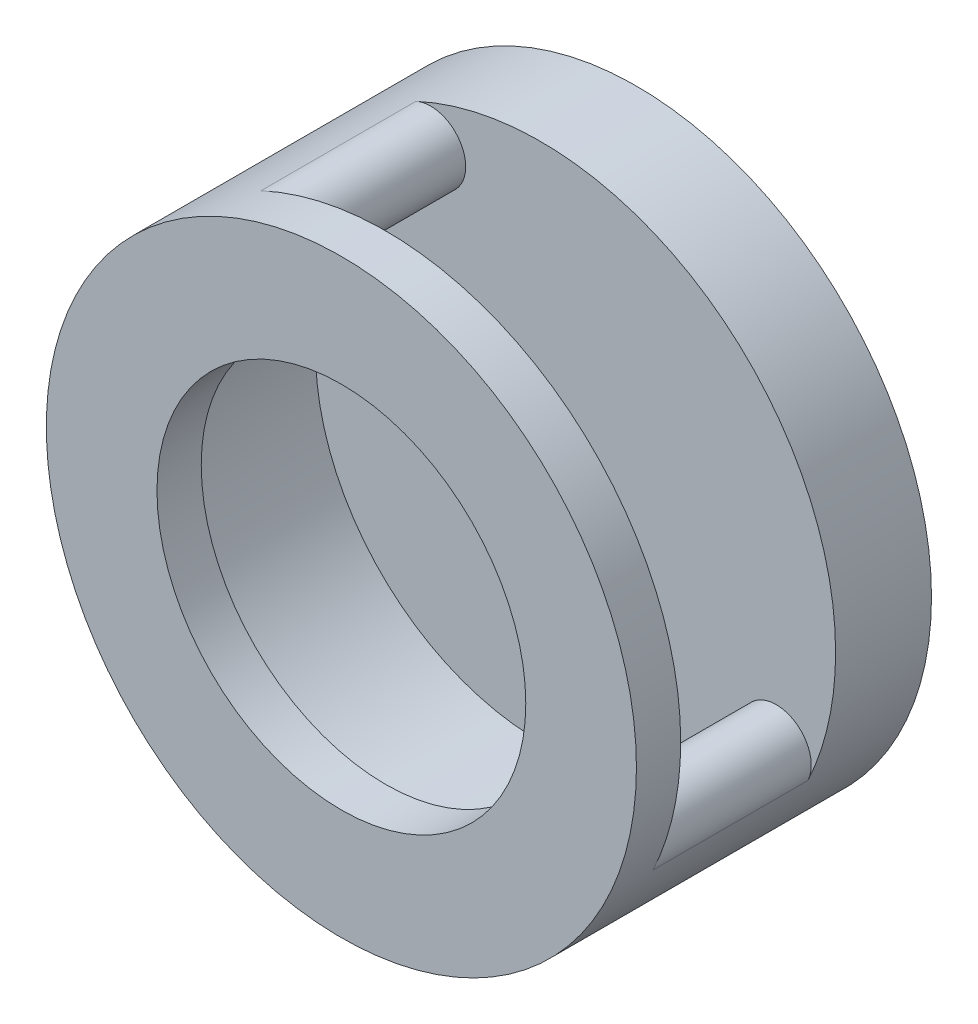
ISO-10303-21;
HEADER;
FILE_DESCRIPTION(('STEP AP214'),'2;1');
FILE_NAME('part.step','',(''),(''),'','','');
FILE_SCHEMA(('AUTOMOTIVE_DESIGN { 1 0 10303 214 1 1 1 1 }'));
ENDSEC;
DATA;
#1=APPLICATION_CONTEXT('core data for automotive mechanical design processes');
#2=APPLICATION_PROTOCOL_DEFINITION('international standard','automotive_design',2000,#1);
#3=PRODUCT_CONTEXT('',#1,'mechanical');
#4=PRODUCT('Part','Part','',(#3));
#5=PRODUCT_RELATED_PRODUCT_CATEGORY('part','',(#4));
#6=PRODUCT_DEFINITION_FORMATION('','',#4);
#7=PRODUCT_DEFINITION_CONTEXT('part definition',#1,'design');
#8=PRODUCT_DEFINITION('design','',#6,#7);
#9=PRODUCT_DEFINITION_SHAPE('','',#8);
#10=(LENGTH_UNIT() NAMED_UNIT(*) SI_UNIT(.MILLI.,.METRE.));
#11=(NAMED_UNIT(*) PLANE_ANGLE_UNIT() SI_UNIT($,.RADIAN.));
#12=(NAMED_UNIT(*) SI_UNIT($,.STERADIAN.) SOLID_ANGLE_UNIT());
#13=UNCERTAINTY_MEASURE_WITH_UNIT(LENGTH_MEASURE(1.E-05),#10,'distance_accuracy_value','');
#14=(GEOMETRIC_REPRESENTATION_CONTEXT(3) GLOBAL_UNCERTAINTY_ASSIGNED_CONTEXT((#13)) GLOBAL_UNIT_ASSIGNED_CONTEXT((#10,
#11,#12)) REPRESENTATION_CONTEXT('',''));
#15=CARTESIAN_POINT('',(0.,0.,0.));
#16=DIRECTION('',(0.,0.,1.));
#17=DIRECTION('',(1.,0.,0.));
#18=AXIS2_PLACEMENT_3D('',#15,#16,#17);
#19=CARTESIAN_POINT('',(0.,0.,4.));
#20=DIRECTION('',(0.,0.,-1.));
#21=DIRECTION('',(-1.,0.,0.));
#22=AXIS2_PLACEMENT_3D('',#19,#20,#21);
#23=CYLINDRICAL_SURFACE('',#22,4.);
#24=CARTESIAN_POINT('',(0.,0.,0.));
#25=DIRECTION('',(0.,0.,1.));
#26=DIRECTION('',(1.,0.,0.));
#27=AXIS2_PLACEMENT_3D('',#24,#25,#26);
#28=CIRCLE('',#27,4.);
#29=CARTESIAN_POINT('',(4.,0.,0.));
#30=VERTEX_POINT('',#29);
#31=EDGE_CURVE('E130',#30,#30,#28,.T.);
#32=ORIENTED_EDGE('',*,*,#31,.T.);
#33=EDGE_LOOP('',(#32));
#34=FACE_BOUND('',#33,.T.);
#35=CARTESIAN_POINT('',(0.,0.,4.));
#36=DIRECTION('',(0.,0.,1.));
#37=DIRECTION('',(1.,0.,0.));
#38=AXIS2_PLACEMENT_3D('',#35,#36,#37);
#39=CIRCLE('',#38,4.);
#40=CARTESIAN_POINT('',(4.,0.,4.));
#41=VERTEX_POINT('',#40);
#42=EDGE_CURVE('E131',#41,#41,#39,.T.);
#43=ORIENTED_EDGE('',*,*,#42,.F.);
#44=EDGE_LOOP('',(#43));
#45=FACE_BOUND('',#44,.T.);
#46=CARTESIAN_POINT('',(0.,0.,1.3));
#47=DIRECTION('',(0.,0.,1.));
#48=DIRECTION('',(1.,0.,0.));
#49=AXIS2_PLACEMENT_3D('',#46,#47,#48);
#50=CIRCLE('',#49,4.);
#51=CARTESIAN_POINT('',(3.62523114814661,-1.69047304696278,1.3));
#52=VERTEX_POINT('',#51);
#53=CARTESIAN_POINT('',(-1.69047304696278,3.62523114814661,1.3));
#54=VERTEX_POINT('',#53);
#55=EDGE_CURVE('E11',#52,#54,#50,.T.);
#56=ORIENTED_EDGE('',*,*,#55,.F.);
#57=DIRECTION('',(0.,0.,1.));
#58=VECTOR('',#57,1.);
#59=CARTESIAN_POINT('',(3.62523114814661,-1.69047304696278,1.3));
#60=LINE('',#59,#58);
#61=CARTESIAN_POINT('',(3.62523114814661,-1.69047304696278,3.4));
#62=VERTEX_POINT('',#61);
#63=EDGE_CURVE('E94',#52,#62,#60,.T.);
#64=ORIENTED_EDGE('',*,*,#63,.T.);
#65=CARTESIAN_POINT('',(0.,0.,3.4));
#66=DIRECTION('',(0.,0.,1.));
#67=DIRECTION('',(1.,0.,0.));
#68=AXIS2_PLACEMENT_3D('',#65,#66,#67);
#69=CIRCLE('',#68,4.);
#70=CARTESIAN_POINT('',(-1.69047304696278,3.62523114814661,3.4));
#71=VERTEX_POINT('',#70);
#72=EDGE_CURVE('E47',#62,#71,#69,.T.);
#73=ORIENTED_EDGE('',*,*,#72,.T.);
#74=DIRECTION('',(0.,0.,1.));
#75=VECTOR('',#74,1.);
#76=CARTESIAN_POINT('',(-1.69047304696278,3.62523114814661,1.3));
#77=LINE('',#76,#75);
#78=EDGE_CURVE('E115',#54,#71,#77,.T.);
#79=ORIENTED_EDGE('',*,*,#78,.F.);
#80=EDGE_LOOP('',(#56,#64,#73,#79));
#81=FACE_BOUND('',#80,.T.);
#82=ADVANCED_FACE('F39',(#34,#45,#81),#23,.T.);
#83=CARTESIAN_POINT('',(0.,0.,4.));
#84=DIRECTION('',(0.,0.,1.));
#85=DIRECTION('',(1.,0.,0.));
#86=AXIS2_PLACEMENT_3D('',#83,#84,#85);
#87=PLANE('',#86);
#88=CARTESIAN_POINT('',(0.,0.,4.));
#89=DIRECTION('',(0.,0.,1.));
#90=DIRECTION('',(1.,0.,0.));
#91=AXIS2_PLACEMENT_3D('',#88,#89,#90);
#92=CIRCLE('',#91,2.5);
#93=CARTESIAN_POINT('',(2.5,0.,4.));
#94=VERTEX_POINT('',#93);
#95=EDGE_CURVE('E126',#94,#94,#92,.T.);
#96=ORIENTED_EDGE('',*,*,#95,.F.);
#97=EDGE_LOOP('',(#96));
#98=FACE_BOUND('',#97,.T.);
#99=ORIENTED_EDGE('',*,*,#42,.T.);
#100=EDGE_LOOP('',(#99));
#101=FACE_BOUND('',#100,.T.);
#102=ADVANCED_FACE('F154',(#98,#101),#87,.T.);
#103=CARTESIAN_POINT('',(0.,0.,0.));
#104=DIRECTION('',(0.,0.,1.));
#105=DIRECTION('',(1.,0.,0.));
#106=AXIS2_PLACEMENT_3D('',#103,#104,#105);
#107=PLANE('',#106);
#108=ORIENTED_EDGE('',*,*,#31,.F.);
#109=EDGE_LOOP('',(#108));
#110=FACE_BOUND('',#109,.T.);
#111=ADVANCED_FACE('F159',(#110),#107,.F.);
#112=CARTESIAN_POINT('',(0.,0.,3.4));
#113=DIRECTION('',(0.,0.,1.));
#114=DIRECTION('',(1.,0.,0.));
#115=AXIS2_PLACEMENT_3D('',#112,#113,#114);
#116=CYLINDRICAL_SURFACE('',#115,2.5);
#117=CARTESIAN_POINT('',(0.,0.,3.4));
#118=DIRECTION('',(0.,0.,1.));
#119=DIRECTION('',(1.,0.,0.));
#120=AXIS2_PLACEMENT_3D('',#117,#118,#119);
#121=CIRCLE('',#120,2.5);
#122=CARTESIAN_POINT('',(2.5,0.,3.4));
#123=VERTEX_POINT('',#122);
#124=EDGE_CURVE('E118',#123,#123,#121,.T.);
#125=ORIENTED_EDGE('',*,*,#124,.F.);
#126=EDGE_LOOP('',(#125));
#127=FACE_BOUND('',#126,.T.);
#128=ORIENTED_EDGE('',*,*,#95,.T.);
#129=EDGE_LOOP('',(#128));
#130=FACE_BOUND('',#129,.T.);
#131=ADVANCED_FACE('F168',(#127,#130),#116,.F.);
#132=CARTESIAN_POINT('',(-1.48972937263595,3.1947349493042,1.3));
#133=DIRECTION('',(0.,0.,1.));
#134=DIRECTION('',(1.,0.,0.));
#135=AXIS2_PLACEMENT_3D('',#132,#133,#134);
#136=PLANE('',#135);
#137=ORIENTED_EDGE('',*,*,#55,.T.);
#138=CARTESIAN_POINT('',(-1.48972937263595,3.1947349493042,1.3));
#139=DIRECTION('',(0.,0.,-1.));
#140=DIRECTION('',(1.,0.,0.));
#141=AXIS2_PLACEMENT_3D('',#138,#139,#140);
#142=CIRCLE('',#141,0.475);
#143=CARTESIAN_POINT('',(-1.28898569830912,2.76423875046179,1.3));
#144=VERTEX_POINT('',#143);
#145=EDGE_CURVE('E102',#54,#144,#142,.T.);
#146=ORIENTED_EDGE('',*,*,#145,.T.);
#147=CARTESIAN_POINT('',(0.,0.,1.3));
#148=DIRECTION('',(0.,0.,1.));
#149=DIRECTION('',(1.,0.,0.));
#150=AXIS2_PLACEMENT_3D('',#147,#148,#149);
#151=CIRCLE('',#150,3.05);
#152=CARTESIAN_POINT('',(2.76423875046179,-1.28898569830912,1.3));
#153=VERTEX_POINT('',#152);
#154=EDGE_CURVE('E90',#144,#153,#151,.T.);
#155=ORIENTED_EDGE('',*,*,#154,.T.);
#156=CARTESIAN_POINT('',(3.1947349493042,-1.48972937263595,1.3));
#157=DIRECTION('',(0.,0.,-1.));
#158=DIRECTION('',(-1.,0.,0.));
#159=AXIS2_PLACEMENT_3D('',#156,#157,#158);
#160=CIRCLE('',#159,0.475);
#161=EDGE_CURVE('E96',#153,#52,#160,.T.);
#162=ORIENTED_EDGE('',*,*,#161,.T.);
#163=EDGE_LOOP('',(#137,#146,#155,#162));
#164=FACE_BOUND('',#163,.T.);
#165=ADVANCED_FACE('F101',(#164),#136,.T.);
#166=CARTESIAN_POINT('',(-1.48972937263595,3.1947349493042,3.4));
#167=DIRECTION('',(0.,0.,1.));
#168=DIRECTION('',(1.,0.,0.));
#169=AXIS2_PLACEMENT_3D('',#166,#167,#168);
#170=PLANE('',#169);
#171=ORIENTED_EDGE('',*,*,#124,.T.);
#172=EDGE_LOOP('',(#171));
#173=FACE_BOUND('',#172,.T.);
#174=CARTESIAN_POINT('',(3.1947349493042,-1.48972937263595,3.4));
#175=DIRECTION('',(0.,0.,-1.));
#176=DIRECTION('',(-1.,0.,0.));
#177=AXIS2_PLACEMENT_3D('',#174,#175,#176);
#178=CIRCLE('',#177,0.475);
#179=CARTESIAN_POINT('',(2.76423875046179,-1.28898569830912,3.4));
#180=VERTEX_POINT('',#179);
#181=EDGE_CURVE('E106',#180,#62,#178,.T.);
#182=ORIENTED_EDGE('',*,*,#181,.F.);
#183=CARTESIAN_POINT('',(0.,0.,3.4));
#184=DIRECTION('',(0.,0.,1.));
#185=DIRECTION('',(1.,0.,0.));
#186=AXIS2_PLACEMENT_3D('',#183,#184,#185);
#187=CIRCLE('',#186,3.05);
#188=CARTESIAN_POINT('',(-1.28898569830912,2.76423875046179,3.4));
#189=VERTEX_POINT('',#188);
#190=EDGE_CURVE('E91',#189,#180,#187,.T.);
#191=ORIENTED_EDGE('',*,*,#190,.F.);
#192=CARTESIAN_POINT('',(-1.48972937263595,3.1947349493042,3.4));
#193=DIRECTION('',(0.,0.,-1.));
#194=DIRECTION('',(1.,0.,0.));
#195=AXIS2_PLACEMENT_3D('',#192,#193,#194);
#196=CIRCLE('',#195,0.475);
#197=EDGE_CURVE('E54',#71,#189,#196,.T.);
#198=ORIENTED_EDGE('',*,*,#197,.F.);
#199=ORIENTED_EDGE('',*,*,#72,.F.);
#200=EDGE_LOOP('',(#182,#191,#198,#199));
#201=FACE_BOUND('',#200,.T.);
#202=ADVANCED_FACE('F142',(#173,#201),#170,.F.);
#203=CARTESIAN_POINT('',(-1.48972937263595,3.1947349493042,1.3));
#204=DIRECTION('',(0.,0.,1.));
#205=DIRECTION('',(1.,0.,0.));
#206=AXIS2_PLACEMENT_3D('',#203,#204,#205);
#207=CYLINDRICAL_SURFACE('',#206,0.475);
#208=ORIENTED_EDGE('',*,*,#197,.T.);
#209=DIRECTION('',(0.,0.,1.));
#210=VECTOR('',#209,1.);
#211=CARTESIAN_POINT('',(-1.28898569830912,2.76423875046179,1.3));
#212=LINE('',#211,#210);
#213=EDGE_CURVE('E81',#144,#189,#212,.T.);
#214=ORIENTED_EDGE('',*,*,#213,.F.);
#215=ORIENTED_EDGE('',*,*,#145,.F.);
#216=ORIENTED_EDGE('',*,*,#78,.T.);
#217=EDGE_LOOP('',(#208,#214,#215,#216));
#218=FACE_BOUND('',#217,.T.);
#219=ADVANCED_FACE('F140',(#218),#207,.T.);
#220=CARTESIAN_POINT('',(3.1947349493042,-1.48972937263595,1.3));
#221=DIRECTION('',(0.,0.,1.));
#222=DIRECTION('',(1.,0.,0.));
#223=AXIS2_PLACEMENT_3D('',#220,#221,#222);
#224=CYLINDRICAL_SURFACE('',#223,0.475);
#225=ORIENTED_EDGE('',*,*,#181,.T.);
#226=ORIENTED_EDGE('',*,*,#63,.F.);
#227=ORIENTED_EDGE('',*,*,#161,.F.);
#228=DIRECTION('',(0.,0.,1.));
#229=VECTOR('',#228,1.);
#230=CARTESIAN_POINT('',(2.76423875046179,-1.28898569830912,1.3));
#231=LINE('',#230,#229);
#232=EDGE_CURVE('E86',#153,#180,#231,.T.);
#233=ORIENTED_EDGE('',*,*,#232,.T.);
#234=EDGE_LOOP('',(#225,#226,#227,#233));
#235=FACE_BOUND('',#234,.T.);
#236=ADVANCED_FACE('F97',(#235),#224,.T.);
#237=CARTESIAN_POINT('',(0.,0.,1.3));
#238=DIRECTION('',(0.,0.,1.));
#239=DIRECTION('',(1.,0.,0.));
#240=AXIS2_PLACEMENT_3D('',#237,#238,#239);
#241=CYLINDRICAL_SURFACE('',#240,3.05);
#242=ORIENTED_EDGE('',*,*,#190,.T.);
#243=ORIENTED_EDGE('',*,*,#232,.F.);
#244=ORIENTED_EDGE('',*,*,#154,.F.);
#245=ORIENTED_EDGE('',*,*,#213,.T.);
#246=EDGE_LOOP('',(#242,#243,#244,#245));
#247=FACE_BOUND('',#246,.T.);
#248=ADVANCED_FACE('F88',(#247),#241,.F.);
#249=CLOSED_SHELL('',(#82,#102,#111,#131,#165,#202,#219,#236,#248));
#250=MANIFOLD_SOLID_BREP('B2',#249);
#251=ADVANCED_BREP_SHAPE_REPRESENTATION('',(#18,#250),#14);
#252=SHAPE_DEFINITION_REPRESENTATION(#9,#251);
ENDSEC;
END-ISO-10303-21;
